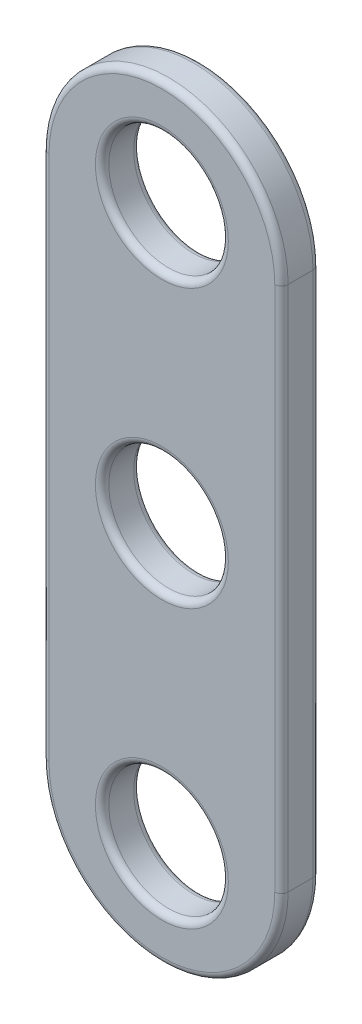
ISO-10303-21;
HEADER;
FILE_DESCRIPTION(('STEP AP214'),'2;1');
FILE_NAME('part.step','',(''),(''),'','','');
FILE_SCHEMA(('AUTOMOTIVE_DESIGN { 1 0 10303 214 1 1 1 1 }'));
ENDSEC;
DATA;
#1=APPLICATION_CONTEXT('core data for automotive mechanical design processes');
#2=APPLICATION_PROTOCOL_DEFINITION('international standard','automotive_design',2000,#1);
#3=PRODUCT_CONTEXT('',#1,'mechanical');
#4=PRODUCT('Part','Part','',(#3));
#5=PRODUCT_RELATED_PRODUCT_CATEGORY('part','',(#4));
#6=PRODUCT_DEFINITION_FORMATION('','',#4);
#7=PRODUCT_DEFINITION_CONTEXT('part definition',#1,'design');
#8=PRODUCT_DEFINITION('design','',#6,#7);
#9=PRODUCT_DEFINITION_SHAPE('','',#8);
#10=(LENGTH_UNIT() NAMED_UNIT(*) SI_UNIT(.MILLI.,.METRE.));
#11=(NAMED_UNIT(*) PLANE_ANGLE_UNIT() SI_UNIT($,.RADIAN.));
#12=(NAMED_UNIT(*) SI_UNIT($,.STERADIAN.) SOLID_ANGLE_UNIT());
#13=UNCERTAINTY_MEASURE_WITH_UNIT(LENGTH_MEASURE(1.E-05),#10,'distance_accuracy_value','');
#14=(GEOMETRIC_REPRESENTATION_CONTEXT(3) GLOBAL_UNCERTAINTY_ASSIGNED_CONTEXT((#13)) GLOBAL_UNIT_ASSIGNED_CONTEXT((#10,
#11,#12)) REPRESENTATION_CONTEXT('',''));
#15=CARTESIAN_POINT('',(0.,0.,0.));
#16=DIRECTION('',(0.,0.,1.));
#17=DIRECTION('',(1.,0.,0.));
#18=AXIS2_PLACEMENT_3D('',#15,#16,#17);
#19=CARTESIAN_POINT('',(0.,-34.925,0.));
#20=DIRECTION('',(0.,0.,-1.));
#21=DIRECTION('',(-1.,0.,0.));
#22=AXIS2_PLACEMENT_3D('',#19,#20,#21);
#23=CYLINDRICAL_SURFACE('',#22,15.875);
#24=DIRECTION('',(0.,0.,-1.));
#25=VECTOR('',#24,1.);
#26=CARTESIAN_POINT('',(-15.875,-34.925,5.08));
#27=LINE('',#26,#25);
#28=CARTESIAN_POINT('',(-15.875,-34.925,0.889));
#29=VERTEX_POINT('',#28);
#30=CARTESIAN_POINT('',(-15.875,-34.925,4.191));
#31=VERTEX_POINT('',#30);
#32=EDGE_CURVE('E255',#29,#31,#27,.F.);
#33=ORIENTED_EDGE('',*,*,#32,.F.);
#34=CARTESIAN_POINT('',(0.,-34.925,0.889));
#35=DIRECTION('',(0.,0.,1.));
#36=DIRECTION('',(1.,0.,0.));
#37=AXIS2_PLACEMENT_3D('',#34,#35,#36);
#38=CIRCLE('',#37,15.875);
#39=CARTESIAN_POINT('',(15.875,-34.925,0.889));
#40=VERTEX_POINT('',#39);
#41=EDGE_CURVE('E196',#29,#40,#38,.T.);
#42=ORIENTED_EDGE('',*,*,#41,.T.);
#43=DIRECTION('',(0.,0.,-1.));
#44=VECTOR('',#43,1.);
#45=CARTESIAN_POINT('',(15.875,-34.925,5.08));
#46=LINE('',#45,#44);
#47=CARTESIAN_POINT('',(15.875,-34.925,4.191));
#48=VERTEX_POINT('',#47);
#49=EDGE_CURVE('E133',#48,#40,#46,.T.);
#50=ORIENTED_EDGE('',*,*,#49,.F.);
#51=CARTESIAN_POINT('',(0.,-34.925,4.191));
#52=DIRECTION('',(0.,0.,1.));
#53=DIRECTION('',(1.,0.,0.));
#54=AXIS2_PLACEMENT_3D('',#51,#52,#53);
#55=CIRCLE('',#54,15.875);
#56=EDGE_CURVE('E193',#48,#31,#55,.F.);
#57=ORIENTED_EDGE('',*,*,#56,.T.);
#58=EDGE_LOOP('',(#33,#42,#50,#57));
#59=FACE_BOUND('',#58,.T.);
#60=ADVANCED_FACE('F43',(#59),#23,.T.);
#61=CARTESIAN_POINT('',(0.,34.925,0.));
#62=DIRECTION('',(0.,0.,-1.));
#63=DIRECTION('',(-1.,0.,0.));
#64=AXIS2_PLACEMENT_3D('',#61,#62,#63);
#65=CYLINDRICAL_SURFACE('',#64,15.875);
#66=DIRECTION('',(0.,0.,-1.));
#67=VECTOR('',#66,1.);
#68=CARTESIAN_POINT('',(15.875,34.925,5.08));
#69=LINE('',#68,#67);
#70=CARTESIAN_POINT('',(15.875,34.925,0.889));
#71=VERTEX_POINT('',#70);
#72=CARTESIAN_POINT('',(15.875,34.925,4.191));
#73=VERTEX_POINT('',#72);
#74=EDGE_CURVE('E230',#71,#73,#69,.F.);
#75=ORIENTED_EDGE('',*,*,#74,.F.);
#76=CARTESIAN_POINT('',(0.,34.925,0.889));
#77=DIRECTION('',(0.,0.,1.));
#78=DIRECTION('',(1.,0.,0.));
#79=AXIS2_PLACEMENT_3D('',#76,#77,#78);
#80=CIRCLE('',#79,15.875);
#81=CARTESIAN_POINT('',(-15.875,34.925,0.889));
#82=VERTEX_POINT('',#81);
#83=EDGE_CURVE('E118',#71,#82,#80,.T.);
#84=ORIENTED_EDGE('',*,*,#83,.T.);
#85=DIRECTION('',(0.,0.,-1.));
#86=VECTOR('',#85,1.);
#87=CARTESIAN_POINT('',(-15.875,34.925,5.08));
#88=LINE('',#87,#86);
#89=CARTESIAN_POINT('',(-15.875,34.925,4.191));
#90=VERTEX_POINT('',#89);
#91=EDGE_CURVE('E264',#90,#82,#88,.T.);
#92=ORIENTED_EDGE('',*,*,#91,.F.);
#93=CARTESIAN_POINT('',(0.,34.925,4.191));
#94=DIRECTION('',(0.,0.,1.));
#95=DIRECTION('',(1.,0.,0.));
#96=AXIS2_PLACEMENT_3D('',#93,#94,#95);
#97=CIRCLE('',#96,15.875);
#98=EDGE_CURVE('E181',#90,#73,#97,.F.);
#99=ORIENTED_EDGE('',*,*,#98,.T.);
#100=EDGE_LOOP('',(#75,#84,#92,#99));
#101=FACE_BOUND('',#100,.T.);
#102=ADVANCED_FACE('F279',(#101),#65,.T.);
#103=CARTESIAN_POINT('',(0.,0.,5.08));
#104=DIRECTION('',(0.,0.,1.));
#105=DIRECTION('',(1.,0.,0.));
#106=AXIS2_PLACEMENT_3D('',#103,#104,#105);
#107=PLANE('',#106);
#108=CARTESIAN_POINT('',(0.,36.83,5.08));
#109=DIRECTION('',(0.,0.,1.));
#110=DIRECTION('',(1.,0.,0.));
#111=AXIS2_PLACEMENT_3D('',#108,#109,#110);
#112=CIRCLE('',#111,8.8265);
#113=CARTESIAN_POINT('',(8.82649999999998,36.83,5.08));
#114=VERTEX_POINT('',#113);
#115=EDGE_CURVE('E11',#114,#114,#112,.F.);
#116=ORIENTED_EDGE('',*,*,#115,.T.);
#117=EDGE_LOOP('',(#116));
#118=FACE_BOUND('',#117,.T.);
#119=CARTESIAN_POINT('',(0.,-36.83,5.08));
#120=DIRECTION('',(0.,0.,1.));
#121=DIRECTION('',(1.,0.,0.));
#122=AXIS2_PLACEMENT_3D('',#119,#120,#121);
#123=CIRCLE('',#122,8.8265);
#124=CARTESIAN_POINT('',(8.82650000000001,-36.83,5.08));
#125=VERTEX_POINT('',#124);
#126=EDGE_CURVE('E53',#125,#125,#123,.F.);
#127=ORIENTED_EDGE('',*,*,#126,.T.);
#128=EDGE_LOOP('',(#127));
#129=FACE_BOUND('',#128,.T.);
#130=DIRECTION('',(0.,1.,0.));
#131=VECTOR('',#130,1.);
#132=CARTESIAN_POINT('',(14.986,34.925,5.08));
#133=LINE('',#132,#131);
#134=CARTESIAN_POINT('',(14.986,-34.925,5.08));
#135=VERTEX_POINT('',#134);
#136=CARTESIAN_POINT('',(14.986,34.925,5.08));
#137=VERTEX_POINT('',#136);
#138=EDGE_CURVE('E61',#135,#137,#133,.T.);
#139=ORIENTED_EDGE('',*,*,#138,.T.);
#140=CARTESIAN_POINT('',(0.,34.925,5.08));
#141=DIRECTION('',(0.,0.,1.));
#142=DIRECTION('',(1.,0.,0.));
#143=AXIS2_PLACEMENT_3D('',#140,#141,#142);
#144=CIRCLE('',#143,14.986);
#145=CARTESIAN_POINT('',(-14.986,34.925,5.08));
#146=VERTEX_POINT('',#145);
#147=EDGE_CURVE('E216',#137,#146,#144,.T.);
#148=ORIENTED_EDGE('',*,*,#147,.T.);
#149=DIRECTION('',(0.,-1.,0.));
#150=VECTOR('',#149,1.);
#151=CARTESIAN_POINT('',(-14.986,-34.925,5.08));
#152=LINE('',#151,#150);
#153=CARTESIAN_POINT('',(-14.986,-34.925,5.08));
#154=VERTEX_POINT('',#153);
#155=EDGE_CURVE('E209',#146,#154,#152,.T.);
#156=ORIENTED_EDGE('',*,*,#155,.T.);
#157=CARTESIAN_POINT('',(0.,-34.925,5.08));
#158=DIRECTION('',(0.,0.,1.));
#159=DIRECTION('',(1.,0.,0.));
#160=AXIS2_PLACEMENT_3D('',#157,#158,#159);
#161=CIRCLE('',#160,14.986);
#162=EDGE_CURVE('E66',#154,#135,#161,.T.);
#163=ORIENTED_EDGE('',*,*,#162,.T.);
#164=EDGE_LOOP('',(#139,#148,#156,#163));
#165=FACE_BOUND('',#164,.T.);
#166=CARTESIAN_POINT('',(0.,0.,5.08));
#167=DIRECTION('',(0.,0.,1.));
#168=DIRECTION('',(1.,0.,0.));
#169=AXIS2_PLACEMENT_3D('',#166,#167,#168);
#170=CIRCLE('',#169,8.8265);
#171=CARTESIAN_POINT('',(8.82649999999999,0.,5.08));
#172=VERTEX_POINT('',#171);
#173=EDGE_CURVE('E205',#172,#172,#170,.F.);
#174=ORIENTED_EDGE('',*,*,#173,.T.);
#175=EDGE_LOOP('',(#174));
#176=FACE_BOUND('',#175,.T.);
#177=ADVANCED_FACE('F293',(#118,#129,#165,#176),#107,.T.);
#178=CARTESIAN_POINT('',(0.,0.,0.));
#179=DIRECTION('',(0.,0.,1.));
#180=DIRECTION('',(1.,0.,0.));
#181=AXIS2_PLACEMENT_3D('',#178,#179,#180);
#182=PLANE('',#181);
#183=CARTESIAN_POINT('',(0.,36.83,0.));
#184=DIRECTION('',(0.,0.,1.));
#185=DIRECTION('',(1.,0.,0.));
#186=AXIS2_PLACEMENT_3D('',#183,#184,#185);
#187=CIRCLE('',#186,8.8265);
#188=CARTESIAN_POINT('',(8.82649999999998,36.83,0.));
#189=VERTEX_POINT('',#188);
#190=EDGE_CURVE('E153',#189,#189,#187,.T.);
#191=ORIENTED_EDGE('',*,*,#190,.T.);
#192=EDGE_LOOP('',(#191));
#193=FACE_BOUND('',#192,.T.);
#194=CARTESIAN_POINT('',(0.,0.,0.));
#195=DIRECTION('',(0.,0.,1.));
#196=DIRECTION('',(1.,0.,0.));
#197=AXIS2_PLACEMENT_3D('',#194,#195,#196);
#198=CIRCLE('',#197,8.8265);
#199=CARTESIAN_POINT('',(8.82649999999999,0.,0.));
#200=VERTEX_POINT('',#199);
#201=EDGE_CURVE('E145',#200,#200,#198,.T.);
#202=ORIENTED_EDGE('',*,*,#201,.T.);
#203=EDGE_LOOP('',(#202));
#204=FACE_BOUND('',#203,.T.);
#205=CARTESIAN_POINT('',(0.,-36.83,0.));
#206=DIRECTION('',(0.,0.,1.));
#207=DIRECTION('',(1.,0.,0.));
#208=AXIS2_PLACEMENT_3D('',#205,#206,#207);
#209=CIRCLE('',#208,8.8265);
#210=CARTESIAN_POINT('',(8.82650000000001,-36.83,0.));
#211=VERTEX_POINT('',#210);
#212=EDGE_CURVE('E140',#211,#211,#209,.T.);
#213=ORIENTED_EDGE('',*,*,#212,.T.);
#214=EDGE_LOOP('',(#213));
#215=FACE_BOUND('',#214,.T.);
#216=DIRECTION('',(0.,-1.,0.));
#217=VECTOR('',#216,1.);
#218=CARTESIAN_POINT('',(-14.986,0.,0.));
#219=LINE('',#218,#217);
#220=CARTESIAN_POINT('',(-14.986,-34.925,0.));
#221=VERTEX_POINT('',#220);
#222=CARTESIAN_POINT('',(-14.986,34.925,0.));
#223=VERTEX_POINT('',#222);
#224=EDGE_CURVE('E137',#221,#223,#219,.F.);
#225=ORIENTED_EDGE('',*,*,#224,.T.);
#226=CARTESIAN_POINT('',(0.,34.925,0.));
#227=DIRECTION('',(0.,0.,1.));
#228=DIRECTION('',(1.,0.,0.));
#229=AXIS2_PLACEMENT_3D('',#226,#227,#228);
#230=CIRCLE('',#229,14.986);
#231=CARTESIAN_POINT('',(14.986,34.925,0.));
#232=VERTEX_POINT('',#231);
#233=EDGE_CURVE('E116',#223,#232,#230,.F.);
#234=ORIENTED_EDGE('',*,*,#233,.T.);
#235=DIRECTION('',(0.,1.,0.));
#236=VECTOR('',#235,1.);
#237=CARTESIAN_POINT('',(14.986,0.,0.));
#238=LINE('',#237,#236);
#239=CARTESIAN_POINT('',(14.986,-34.925,0.));
#240=VERTEX_POINT('',#239);
#241=EDGE_CURVE('E125',#232,#240,#238,.F.);
#242=ORIENTED_EDGE('',*,*,#241,.T.);
#243=CARTESIAN_POINT('',(0.,-34.925,0.));
#244=DIRECTION('',(0.,0.,1.));
#245=DIRECTION('',(1.,0.,0.));
#246=AXIS2_PLACEMENT_3D('',#243,#244,#245);
#247=CIRCLE('',#246,14.986);
#248=EDGE_CURVE('E132',#240,#221,#247,.F.);
#249=ORIENTED_EDGE('',*,*,#248,.T.);
#250=EDGE_LOOP('',(#225,#234,#242,#249));
#251=FACE_BOUND('',#250,.T.);
#252=ADVANCED_FACE('F135',(#193,#204,#215,#251),#182,.F.);
#253=CARTESIAN_POINT('',(15.875,50.8,5.08));
#254=DIRECTION('',(-1.,0.,0.));
#255=DIRECTION('',(0.,-1.,0.));
#256=AXIS2_PLACEMENT_3D('',#253,#254,#255);
#257=PLANE('',#256);
#258=ORIENTED_EDGE('',*,*,#49,.T.);
#259=DIRECTION('',(0.,1.,0.));
#260=VECTOR('',#259,1.);
#261=CARTESIAN_POINT('',(15.875,50.8,0.889));
#262=LINE('',#261,#260);
#263=EDGE_CURVE('E202',#40,#71,#262,.T.);
#264=ORIENTED_EDGE('',*,*,#263,.T.);
#265=ORIENTED_EDGE('',*,*,#74,.T.);
#266=DIRECTION('',(0.,1.,0.));
#267=VECTOR('',#266,1.);
#268=CARTESIAN_POINT('',(15.875,-34.925,4.191));
#269=LINE('',#268,#267);
#270=EDGE_CURVE('E199',#73,#48,#269,.F.);
#271=ORIENTED_EDGE('',*,*,#270,.T.);
#272=EDGE_LOOP('',(#258,#264,#265,#271));
#273=FACE_BOUND('',#272,.T.);
#274=ADVANCED_FACE('F284',(#273),#257,.F.);
#275=CARTESIAN_POINT('',(-15.875,50.8,5.08));
#276=DIRECTION('',(1.,0.,0.));
#277=DIRECTION('',(0.,1.,0.));
#278=AXIS2_PLACEMENT_3D('',#275,#276,#277);
#279=PLANE('',#278);
#280=ORIENTED_EDGE('',*,*,#91,.T.);
#281=DIRECTION('',(0.,-1.,0.));
#282=VECTOR('',#281,1.);
#283=CARTESIAN_POINT('',(-15.875,50.8,0.889));
#284=LINE('',#283,#282);
#285=EDGE_CURVE('E190',#82,#29,#284,.T.);
#286=ORIENTED_EDGE('',*,*,#285,.T.);
#287=ORIENTED_EDGE('',*,*,#32,.T.);
#288=DIRECTION('',(0.,-1.,0.));
#289=VECTOR('',#288,1.);
#290=CARTESIAN_POINT('',(-15.875,34.925,4.191));
#291=LINE('',#290,#289);
#292=EDGE_CURVE('E187',#31,#90,#291,.F.);
#293=ORIENTED_EDGE('',*,*,#292,.T.);
#294=EDGE_LOOP('',(#280,#286,#287,#293));
#295=FACE_BOUND('',#294,.T.);
#296=ADVANCED_FACE('F260',(#295),#279,.F.);
#297=CARTESIAN_POINT('',(0.,-36.83,5.08));
#298=DIRECTION('',(0.,0.,-1.));
#299=DIRECTION('',(-1.,0.,0.));
#300=AXIS2_PLACEMENT_3D('',#297,#298,#299);
#301=CYLINDRICAL_SURFACE('',#300,7.9375);
#302=CARTESIAN_POINT('',(0.,-36.83,0.889));
#303=DIRECTION('',(0.,0.,1.));
#304=DIRECTION('',(1.,0.,0.));
#305=AXIS2_PLACEMENT_3D('',#302,#303,#304);
#306=CIRCLE('',#305,7.9375);
#307=CARTESIAN_POINT('',(7.93750000000001,-36.83,0.889));
#308=VERTEX_POINT('',#307);
#309=EDGE_CURVE('E177',#308,#308,#306,.F.);
#310=ORIENTED_EDGE('',*,*,#309,.T.);
#311=EDGE_LOOP('',(#310));
#312=FACE_BOUND('',#311,.T.);
#313=CARTESIAN_POINT('',(0.,-36.83,4.191));
#314=DIRECTION('',(0.,0.,1.));
#315=DIRECTION('',(1.,0.,0.));
#316=AXIS2_PLACEMENT_3D('',#313,#314,#315);
#317=CIRCLE('',#316,7.9375);
#318=CARTESIAN_POINT('',(7.93750000000001,-36.83,4.191));
#319=VERTEX_POINT('',#318);
#320=EDGE_CURVE('E173',#319,#319,#317,.T.);
#321=ORIENTED_EDGE('',*,*,#320,.T.);
#322=EDGE_LOOP('',(#321));
#323=FACE_BOUND('',#322,.T.);
#324=ADVANCED_FACE('F291',(#312,#323),#301,.F.);
#325=CARTESIAN_POINT('',(0.,0.,5.08));
#326=DIRECTION('',(0.,0.,-1.));
#327=DIRECTION('',(-1.,0.,0.));
#328=AXIS2_PLACEMENT_3D('',#325,#326,#327);
#329=CYLINDRICAL_SURFACE('',#328,7.9375);
#330=CARTESIAN_POINT('',(0.,0.,0.889));
#331=DIRECTION('',(0.,0.,1.));
#332=DIRECTION('',(1.,0.,0.));
#333=AXIS2_PLACEMENT_3D('',#330,#331,#332);
#334=CIRCLE('',#333,7.9375);
#335=CARTESIAN_POINT('',(7.93749999999999,0.,0.889));
#336=VERTEX_POINT('',#335);
#337=EDGE_CURVE('E169',#336,#336,#334,.F.);
#338=ORIENTED_EDGE('',*,*,#337,.T.);
#339=EDGE_LOOP('',(#338));
#340=FACE_BOUND('',#339,.T.);
#341=CARTESIAN_POINT('',(0.,0.,4.191));
#342=DIRECTION('',(0.,0.,1.));
#343=DIRECTION('',(1.,0.,0.));
#344=AXIS2_PLACEMENT_3D('',#341,#342,#343);
#345=CIRCLE('',#344,7.9375);
#346=CARTESIAN_POINT('',(7.93749999999999,0.,4.191));
#347=VERTEX_POINT('',#346);
#348=EDGE_CURVE('E165',#347,#347,#345,.T.);
#349=ORIENTED_EDGE('',*,*,#348,.T.);
#350=EDGE_LOOP('',(#349));
#351=FACE_BOUND('',#350,.T.);
#352=ADVANCED_FACE('F468',(#340,#351),#329,.F.);
#353=CARTESIAN_POINT('',(0.,36.83,5.08));
#354=DIRECTION('',(0.,0.,-1.));
#355=DIRECTION('',(-1.,0.,0.));
#356=AXIS2_PLACEMENT_3D('',#353,#354,#355);
#357=CYLINDRICAL_SURFACE('',#356,7.9375);
#358=CARTESIAN_POINT('',(0.,36.83,0.889));
#359=DIRECTION('',(0.,0.,1.));
#360=DIRECTION('',(1.,0.,0.));
#361=AXIS2_PLACEMENT_3D('',#358,#359,#360);
#362=CIRCLE('',#361,7.9375);
#363=CARTESIAN_POINT('',(7.93749999999998,36.83,0.889));
#364=VERTEX_POINT('',#363);
#365=EDGE_CURVE('E161',#364,#364,#362,.F.);
#366=ORIENTED_EDGE('',*,*,#365,.T.);
#367=EDGE_LOOP('',(#366));
#368=FACE_BOUND('',#367,.T.);
#369=CARTESIAN_POINT('',(0.,36.83,4.191));
#370=DIRECTION('',(0.,0.,1.));
#371=DIRECTION('',(1.,0.,0.));
#372=AXIS2_PLACEMENT_3D('',#369,#370,#371);
#373=CIRCLE('',#372,7.9375);
#374=CARTESIAN_POINT('',(7.93749999999998,36.83,4.191));
#375=VERTEX_POINT('',#374);
#376=EDGE_CURVE('E157',#375,#375,#373,.T.);
#377=ORIENTED_EDGE('',*,*,#376,.T.);
#378=EDGE_LOOP('',(#377));
#379=FACE_BOUND('',#378,.T.);
#380=ADVANCED_FACE('F311',(#368,#379),#357,.F.);
#381=CARTESIAN_POINT('',(0.,36.83,0.889));
#382=DIRECTION('',(0.,0.,1.));
#383=DIRECTION('',(1.,0.,0.));
#384=AXIS2_PLACEMENT_3D('',#381,#382,#383);
#385=TOROIDAL_SURFACE('',#384,8.8265,0.889);
#386=ORIENTED_EDGE('',*,*,#365,.F.);
#387=EDGE_LOOP('',(#386));
#388=FACE_BOUND('',#387,.T.);
#389=ORIENTED_EDGE('',*,*,#190,.F.);
#390=EDGE_LOOP('',(#389));
#391=FACE_BOUND('',#390,.T.);
#392=ADVANCED_FACE('F307',(#388,#391),#385,.T.);
#393=CARTESIAN_POINT('',(0.,0.,0.889));
#394=DIRECTION('',(0.,0.,1.));
#395=DIRECTION('',(1.,0.,0.));
#396=AXIS2_PLACEMENT_3D('',#393,#394,#395);
#397=TOROIDAL_SURFACE('',#396,8.8265,0.889);
#398=ORIENTED_EDGE('',*,*,#337,.F.);
#399=EDGE_LOOP('',(#398));
#400=FACE_BOUND('',#399,.T.);
#401=ORIENTED_EDGE('',*,*,#201,.F.);
#402=EDGE_LOOP('',(#401));
#403=FACE_BOUND('',#402,.T.);
#404=ADVANCED_FACE('F310',(#400,#403),#397,.T.);
#405=CARTESIAN_POINT('',(0.,-36.83,0.889));
#406=DIRECTION('',(0.,0.,1.));
#407=DIRECTION('',(1.,0.,0.));
#408=AXIS2_PLACEMENT_3D('',#405,#406,#407);
#409=TOROIDAL_SURFACE('',#408,8.8265,0.889);
#410=ORIENTED_EDGE('',*,*,#309,.F.);
#411=EDGE_LOOP('',(#410));
#412=FACE_BOUND('',#411,.T.);
#413=ORIENTED_EDGE('',*,*,#212,.F.);
#414=EDGE_LOOP('',(#413));
#415=FACE_BOUND('',#414,.T.);
#416=ADVANCED_FACE('F315',(#412,#415),#409,.T.);
#417=CARTESIAN_POINT('',(0.,-34.925,0.889));
#418=DIRECTION('',(0.,0.,1.));
#419=DIRECTION('',(1.,0.,0.));
#420=AXIS2_PLACEMENT_3D('',#417,#418,#419);
#421=TOROIDAL_SURFACE('',#420,14.986,0.889);
#422=CARTESIAN_POINT('',(14.986,-34.925,0.889));
#423=DIRECTION('',(0.,1.,0.));
#424=DIRECTION('',(0.,0.,1.));
#425=AXIS2_PLACEMENT_3D('',#422,#423,#424);
#426=CIRCLE('',#425,0.889);
#427=EDGE_CURVE('E128',#40,#240,#426,.T.);
#428=ORIENTED_EDGE('',*,*,#427,.F.);
#429=ORIENTED_EDGE('',*,*,#41,.F.);
#430=CARTESIAN_POINT('',(-14.986,-34.925,0.889));
#431=DIRECTION('',(0.,1.,0.));
#432=DIRECTION('',(0.,0.,1.));
#433=AXIS2_PLACEMENT_3D('',#430,#431,#432);
#434=CIRCLE('',#433,0.889);
#435=EDGE_CURVE('E226',#221,#29,#434,.T.);
#436=ORIENTED_EDGE('',*,*,#435,.F.);
#437=ORIENTED_EDGE('',*,*,#248,.F.);
#438=EDGE_LOOP('',(#428,#429,#436,#437));
#439=FACE_BOUND('',#438,.T.);
#440=ADVANCED_FACE('F274',(#439),#421,.T.);
#441=CARTESIAN_POINT('',(-14.986,50.8,0.889));
#442=DIRECTION('',(0.,-1.,0.));
#443=DIRECTION('',(1.,0.,0.));
#444=AXIS2_PLACEMENT_3D('',#441,#442,#443);
#445=CYLINDRICAL_SURFACE('',#444,0.889);
#446=ORIENTED_EDGE('',*,*,#435,.T.);
#447=ORIENTED_EDGE('',*,*,#285,.F.);
#448=CARTESIAN_POINT('',(-14.986,34.925,0.889));
#449=DIRECTION('',(0.,1.,0.));
#450=DIRECTION('',(0.,0.,1.));
#451=AXIS2_PLACEMENT_3D('',#448,#449,#450);
#452=CIRCLE('',#451,0.889);
#453=EDGE_CURVE('E122',#223,#82,#452,.T.);
#454=ORIENTED_EDGE('',*,*,#453,.F.);
#455=ORIENTED_EDGE('',*,*,#224,.F.);
#456=EDGE_LOOP('',(#446,#447,#454,#455));
#457=FACE_BOUND('',#456,.T.);
#458=ADVANCED_FACE('F276',(#457),#445,.T.);
#459=CARTESIAN_POINT('',(14.986,50.8,0.889));
#460=DIRECTION('',(0.,1.,0.));
#461=DIRECTION('',(-1.,0.,0.));
#462=AXIS2_PLACEMENT_3D('',#459,#460,#461);
#463=CYLINDRICAL_SURFACE('',#462,0.889);
#464=ORIENTED_EDGE('',*,*,#427,.T.);
#465=ORIENTED_EDGE('',*,*,#241,.F.);
#466=CARTESIAN_POINT('',(14.986,34.925,0.889));
#467=DIRECTION('',(0.,1.,0.));
#468=DIRECTION('',(0.,0.,1.));
#469=AXIS2_PLACEMENT_3D('',#466,#467,#468);
#470=CIRCLE('',#469,0.889);
#471=EDGE_CURVE('E112',#71,#232,#470,.T.);
#472=ORIENTED_EDGE('',*,*,#471,.F.);
#473=ORIENTED_EDGE('',*,*,#263,.F.);
#474=EDGE_LOOP('',(#464,#465,#472,#473));
#475=FACE_BOUND('',#474,.T.);
#476=ADVANCED_FACE('F126',(#475),#463,.T.);
#477=CARTESIAN_POINT('',(0.,34.925,0.889));
#478=DIRECTION('',(0.,0.,1.));
#479=DIRECTION('',(1.,0.,0.));
#480=AXIS2_PLACEMENT_3D('',#477,#478,#479);
#481=TOROIDAL_SURFACE('',#480,14.986,0.889);
#482=ORIENTED_EDGE('',*,*,#453,.T.);
#483=ORIENTED_EDGE('',*,*,#83,.F.);
#484=ORIENTED_EDGE('',*,*,#471,.T.);
#485=ORIENTED_EDGE('',*,*,#233,.F.);
#486=EDGE_LOOP('',(#482,#483,#484,#485));
#487=FACE_BOUND('',#486,.T.);
#488=ADVANCED_FACE('F114',(#487),#481,.T.);
#489=CARTESIAN_POINT('',(0.,36.83,4.191));
#490=DIRECTION('',(0.,0.,1.));
#491=DIRECTION('',(1.,0.,0.));
#492=AXIS2_PLACEMENT_3D('',#489,#490,#491);
#493=TOROIDAL_SURFACE('',#492,8.8265,0.889);
#494=ORIENTED_EDGE('',*,*,#115,.F.);
#495=EDGE_LOOP('',(#494));
#496=FACE_BOUND('',#495,.T.);
#497=ORIENTED_EDGE('',*,*,#376,.F.);
#498=EDGE_LOOP('',(#497));
#499=FACE_BOUND('',#498,.T.);
#500=ADVANCED_FACE('F322',(#496,#499),#493,.T.);
#501=CARTESIAN_POINT('',(0.,-36.83,4.191));
#502=DIRECTION('',(0.,0.,1.));
#503=DIRECTION('',(1.,0.,0.));
#504=AXIS2_PLACEMENT_3D('',#501,#502,#503);
#505=TOROIDAL_SURFACE('',#504,8.8265,0.889);
#506=ORIENTED_EDGE('',*,*,#126,.F.);
#507=EDGE_LOOP('',(#506));
#508=FACE_BOUND('',#507,.T.);
#509=ORIENTED_EDGE('',*,*,#320,.F.);
#510=EDGE_LOOP('',(#509));
#511=FACE_BOUND('',#510,.T.);
#512=ADVANCED_FACE('F331',(#508,#511),#505,.T.);
#513=CARTESIAN_POINT('',(0.,-34.925,4.191));
#514=DIRECTION('',(0.,0.,1.));
#515=DIRECTION('',(1.,0.,0.));
#516=AXIS2_PLACEMENT_3D('',#513,#514,#515);
#517=TOROIDAL_SURFACE('',#516,14.986,0.889);
#518=CARTESIAN_POINT('',(-14.986,-34.925,4.191));
#519=DIRECTION('',(0.,1.,0.));
#520=DIRECTION('',(0.,0.,1.));
#521=AXIS2_PLACEMENT_3D('',#518,#519,#520);
#522=CIRCLE('',#521,0.889);
#523=EDGE_CURVE('E236',#31,#154,#522,.T.);
#524=ORIENTED_EDGE('',*,*,#523,.F.);
#525=ORIENTED_EDGE('',*,*,#56,.F.);
#526=CARTESIAN_POINT('',(14.986,-34.925,4.191));
#527=DIRECTION('',(0.,1.,0.));
#528=DIRECTION('',(0.,0.,1.));
#529=AXIS2_PLACEMENT_3D('',#526,#527,#528);
#530=CIRCLE('',#529,0.889);
#531=EDGE_CURVE('E47',#135,#48,#530,.T.);
#532=ORIENTED_EDGE('',*,*,#531,.F.);
#533=ORIENTED_EDGE('',*,*,#162,.F.);
#534=EDGE_LOOP('',(#524,#525,#532,#533));
#535=FACE_BOUND('',#534,.T.);
#536=ADVANCED_FACE('F250',(#535),#517,.T.);
#537=CARTESIAN_POINT('',(14.986,0.,4.191));
#538=DIRECTION('',(0.,-1.,0.));
#539=DIRECTION('',(1.,0.,0.));
#540=AXIS2_PLACEMENT_3D('',#537,#538,#539);
#541=CYLINDRICAL_SURFACE('',#540,0.889);
#542=ORIENTED_EDGE('',*,*,#531,.T.);
#543=ORIENTED_EDGE('',*,*,#270,.F.);
#544=CARTESIAN_POINT('',(14.986,34.925,4.191));
#545=DIRECTION('',(0.,1.,0.));
#546=DIRECTION('',(0.,0.,1.));
#547=AXIS2_PLACEMENT_3D('',#544,#545,#546);
#548=CIRCLE('',#547,0.889);
#549=EDGE_CURVE('E234',#137,#73,#548,.T.);
#550=ORIENTED_EDGE('',*,*,#549,.F.);
#551=ORIENTED_EDGE('',*,*,#138,.F.);
#552=EDGE_LOOP('',(#542,#543,#550,#551));
#553=FACE_BOUND('',#552,.T.);
#554=ADVANCED_FACE('F247',(#553),#541,.T.);
#555=CARTESIAN_POINT('',(-14.986,0.,4.191));
#556=DIRECTION('',(0.,1.,0.));
#557=DIRECTION('',(-1.,0.,0.));
#558=AXIS2_PLACEMENT_3D('',#555,#556,#557);
#559=CYLINDRICAL_SURFACE('',#558,0.889);
#560=ORIENTED_EDGE('',*,*,#523,.T.);
#561=ORIENTED_EDGE('',*,*,#155,.F.);
#562=CARTESIAN_POINT('',(-14.986,34.925,4.191));
#563=DIRECTION('',(0.,1.,0.));
#564=DIRECTION('',(0.,0.,1.));
#565=AXIS2_PLACEMENT_3D('',#562,#563,#564);
#566=CIRCLE('',#565,0.889);
#567=EDGE_CURVE('E231',#90,#146,#566,.T.);
#568=ORIENTED_EDGE('',*,*,#567,.F.);
#569=ORIENTED_EDGE('',*,*,#292,.F.);
#570=EDGE_LOOP('',(#560,#561,#568,#569));
#571=FACE_BOUND('',#570,.T.);
#572=ADVANCED_FACE('F339',(#571),#559,.T.);
#573=CARTESIAN_POINT('',(0.,34.925,4.191));
#574=DIRECTION('',(0.,0.,1.));
#575=DIRECTION('',(1.,0.,0.));
#576=AXIS2_PLACEMENT_3D('',#573,#574,#575);
#577=TOROIDAL_SURFACE('',#576,14.986,0.889);
#578=ORIENTED_EDGE('',*,*,#549,.T.);
#579=ORIENTED_EDGE('',*,*,#98,.F.);
#580=ORIENTED_EDGE('',*,*,#567,.T.);
#581=ORIENTED_EDGE('',*,*,#147,.F.);
#582=EDGE_LOOP('',(#578,#579,#580,#581));
#583=FACE_BOUND('',#582,.T.);
#584=ADVANCED_FACE('F336',(#583),#577,.T.);
#585=CARTESIAN_POINT('',(0.,0.,4.191));
#586=DIRECTION('',(0.,0.,1.));
#587=DIRECTION('',(1.,0.,0.));
#588=AXIS2_PLACEMENT_3D('',#585,#586,#587);
#589=TOROIDAL_SURFACE('',#588,8.8265,0.889);
#590=ORIENTED_EDGE('',*,*,#173,.F.);
#591=EDGE_LOOP('',(#590));
#592=FACE_BOUND('',#591,.T.);
#593=ORIENTED_EDGE('',*,*,#348,.F.);
#594=EDGE_LOOP('',(#593));
#595=FACE_BOUND('',#594,.T.);
#596=ADVANCED_FACE('F45',(#592,#595),#589,.T.);
#597=CLOSED_SHELL('',(#60,#102,#177,#252,#274,#296,#324,#352,#380,#392,#404,#416,#440,#458,#476,
#488,#500,#512,#536,#554,#572,#584,#596));
#598=MANIFOLD_SOLID_BREP('B2',#597);
#599=ADVANCED_BREP_SHAPE_REPRESENTATION('',(#18,#598),#14);
#600=SHAPE_DEFINITION_REPRESENTATION(#9,#599);
ENDSEC;
END-ISO-10303-21;
